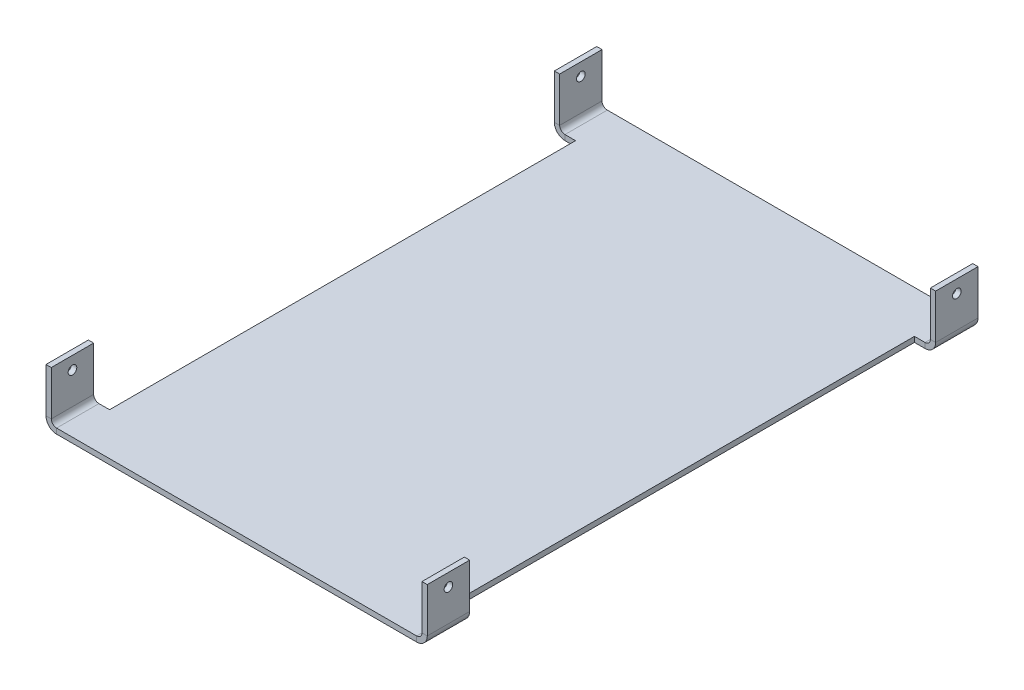
ISO-10303-21;
HEADER;
FILE_DESCRIPTION(('STEP AP214'),'2;1');
FILE_NAME('part.step','',(''),(''),'','','');
FILE_SCHEMA(('AUTOMOTIVE_DESIGN { 1 0 10303 214 1 1 1 1 }'));
ENDSEC;
DATA;
#1=APPLICATION_CONTEXT('core data for automotive mechanical design processes');
#2=APPLICATION_PROTOCOL_DEFINITION('international standard','automotive_design',2000,#1);
#3=PRODUCT_CONTEXT('',#1,'mechanical');
#4=PRODUCT('Part','Part','',(#3));
#5=PRODUCT_RELATED_PRODUCT_CATEGORY('part','',(#4));
#6=PRODUCT_DEFINITION_FORMATION('','',#4);
#7=PRODUCT_DEFINITION_CONTEXT('part definition',#1,'design');
#8=PRODUCT_DEFINITION('design','',#6,#7);
#9=PRODUCT_DEFINITION_SHAPE('','',#8);
#10=(LENGTH_UNIT() NAMED_UNIT(*) SI_UNIT(.MILLI.,.METRE.));
#11=(NAMED_UNIT(*) PLANE_ANGLE_UNIT() SI_UNIT($,.RADIAN.));
#12=(NAMED_UNIT(*) SI_UNIT($,.STERADIAN.) SOLID_ANGLE_UNIT());
#13=UNCERTAINTY_MEASURE_WITH_UNIT(LENGTH_MEASURE(1.E-05),#10,'distance_accuracy_value','');
#14=(GEOMETRIC_REPRESENTATION_CONTEXT(3) GLOBAL_UNCERTAINTY_ASSIGNED_CONTEXT((#13)) GLOBAL_UNIT_ASSIGNED_CONTEXT((#10,
#11,#12)) REPRESENTATION_CONTEXT('',''));
#15=CARTESIAN_POINT('',(0.,0.,0.));
#16=DIRECTION('',(0.,0.,1.));
#17=DIRECTION('',(1.,0.,0.));
#18=AXIS2_PLACEMENT_3D('',#15,#16,#17);
#19=CARTESIAN_POINT('',(-12.7,0.,304.8));
#20=DIRECTION('',(0.,0.,1.));
#21=DIRECTION('',(1.,0.,0.));
#22=AXIS2_PLACEMENT_3D('',#19,#20,#21);
#23=PLANE('',#22);
#24=DIRECTION('',(1.,0.,0.));
#25=VECTOR('',#24,1.);
#26=CARTESIAN_POINT('',(-228.6,3.175,304.8));
#27=LINE('',#26,#25);
#28=CARTESIAN_POINT('',(-12.7,3.175,304.8));
#29=VERTEX_POINT('',#28);
#30=CARTESIAN_POINT('',(-6.34999999999999,3.175,304.8));
#31=VERTEX_POINT('',#30);
#32=EDGE_CURVE('E258',#29,#31,#27,.T.);
#33=ORIENTED_EDGE('',*,*,#32,.T.);
#34=DIRECTION('',(0.,-1.,0.));
#35=VECTOR('',#34,1.);
#36=CARTESIAN_POINT('',(-6.34999999999999,3.175,304.8));
#37=LINE('',#36,#35);
#38=CARTESIAN_POINT('',(-6.35,0.,304.8));
#39=VERTEX_POINT('',#38);
#40=EDGE_CURVE('E11',#31,#39,#37,.T.);
#41=ORIENTED_EDGE('',*,*,#40,.T.);
#42=DIRECTION('',(1.,0.,0.));
#43=VECTOR('',#42,1.);
#44=CARTESIAN_POINT('',(-12.7,0.,304.8));
#45=LINE('',#44,#43);
#46=CARTESIAN_POINT('',(-12.7,0.,304.8));
#47=VERTEX_POINT('',#46);
#48=EDGE_CURVE('E239',#47,#39,#45,.T.);
#49=ORIENTED_EDGE('',*,*,#48,.F.);
#50=DIRECTION('',(0.,1.,0.));
#51=VECTOR('',#50,1.);
#52=CARTESIAN_POINT('',(-12.7,0.,304.8));
#53=LINE('',#52,#51);
#54=EDGE_CURVE('E223',#47,#29,#53,.T.);
#55=ORIENTED_EDGE('',*,*,#54,.T.);
#56=EDGE_LOOP('',(#33,#41,#49,#55));
#57=FACE_BOUND('',#56,.T.);
#58=ADVANCED_FACE('F38',(#57),#23,.F.);
#59=DIRECTION('',(0.,1.,0.));
#60=VECTOR('',#59,1.);
#61=CARTESIAN_POINT('',(0.,0.,304.8));
#62=LINE('',#61,#60);
#63=CARTESIAN_POINT('',(0.,6.35,304.8));
#64=VERTEX_POINT('',#63);
#65=CARTESIAN_POINT('',(0.,33.02,304.8));
#66=VERTEX_POINT('',#65);
#67=EDGE_CURVE('E254',#64,#66,#62,.T.);
#68=ORIENTED_EDGE('',*,*,#67,.F.);
#69=DIRECTION('',(-1.,0.,0.));
#70=VECTOR('',#69,1.);
#71=CARTESIAN_POINT('',(0.,6.35,304.8));
#72=LINE('',#71,#70);
#73=CARTESIAN_POINT('',(-3.175,6.35,304.8));
#74=VERTEX_POINT('',#73);
#75=EDGE_CURVE('E46',#64,#74,#72,.T.);
#76=ORIENTED_EDGE('',*,*,#75,.T.);
#77=DIRECTION('',(0.,1.,0.));
#78=VECTOR('',#77,1.);
#79=CARTESIAN_POINT('',(-3.175,0.,304.8));
#80=LINE('',#79,#78);
#81=CARTESIAN_POINT('',(-3.175,33.02,304.8));
#82=VERTEX_POINT('',#81);
#83=EDGE_CURVE('E262',#74,#82,#80,.T.);
#84=ORIENTED_EDGE('',*,*,#83,.T.);
#85=DIRECTION('',(1.,0.,0.));
#86=VECTOR('',#85,1.);
#87=CARTESIAN_POINT('',(-12.7,33.02,304.8));
#88=LINE('',#87,#86);
#89=EDGE_CURVE('E249',#82,#66,#88,.T.);
#90=ORIENTED_EDGE('',*,*,#89,.T.);
#91=EDGE_LOOP('',(#68,#76,#84,#90));
#92=FACE_BOUND('',#91,.T.);
#93=ADVANCED_FACE('F503',(#92),#23,.F.);
#94=CARTESIAN_POINT('',(-12.7,0.,25.4));
#95=DIRECTION('',(0.,0.,-1.));
#96=DIRECTION('',(-1.,0.,0.));
#97=AXIS2_PLACEMENT_3D('',#94,#95,#96);
#98=PLANE('',#97);
#99=DIRECTION('',(-1.,0.,0.));
#100=VECTOR('',#99,1.);
#101=CARTESIAN_POINT('',(-12.7,0.,25.4));
#102=LINE('',#101,#100);
#103=CARTESIAN_POINT('',(-6.35,0.,25.4));
#104=VERTEX_POINT('',#103);
#105=CARTESIAN_POINT('',(-12.7,0.,25.4));
#106=VERTEX_POINT('',#105);
#107=EDGE_CURVE('E236',#104,#106,#102,.T.);
#108=ORIENTED_EDGE('',*,*,#107,.F.);
#109=DIRECTION('',(0.,1.,0.));
#110=VECTOR('',#109,1.);
#111=CARTESIAN_POINT('',(-6.35,0.,25.4));
#112=LINE('',#111,#110);
#113=CARTESIAN_POINT('',(-6.34999999999999,3.175,25.4));
#114=VERTEX_POINT('',#113);
#115=EDGE_CURVE('E501',#104,#114,#112,.T.);
#116=ORIENTED_EDGE('',*,*,#115,.T.);
#117=DIRECTION('',(-1.,0.,0.));
#118=VECTOR('',#117,1.);
#119=CARTESIAN_POINT('',(-228.6,3.175,25.4000000000003));
#120=LINE('',#119,#118);
#121=CARTESIAN_POINT('',(-12.7,3.175,25.4));
#122=VERTEX_POINT('',#121);
#123=EDGE_CURVE('E267',#114,#122,#120,.T.);
#124=ORIENTED_EDGE('',*,*,#123,.T.);
#125=DIRECTION('',(0.,1.,0.));
#126=VECTOR('',#125,1.);
#127=CARTESIAN_POINT('',(-12.7,0.,25.4));
#128=LINE('',#127,#126);
#129=EDGE_CURVE('E235',#106,#122,#128,.T.);
#130=ORIENTED_EDGE('',*,*,#129,.F.);
#131=EDGE_LOOP('',(#108,#116,#124,#130));
#132=FACE_BOUND('',#131,.T.);
#133=ADVANCED_FACE('F587',(#132),#98,.F.);
#134=DIRECTION('',(0.,-1.,0.));
#135=VECTOR('',#134,1.);
#136=CARTESIAN_POINT('',(-3.175,0.,25.4));
#137=LINE('',#136,#135);
#138=CARTESIAN_POINT('',(-3.175,33.02,25.4));
#139=VERTEX_POINT('',#138);
#140=CARTESIAN_POINT('',(-3.175,6.35,25.4));
#141=VERTEX_POINT('',#140);
#142=EDGE_CURVE('E272',#139,#141,#137,.T.);
#143=ORIENTED_EDGE('',*,*,#142,.T.);
#144=DIRECTION('',(1.,0.,0.));
#145=VECTOR('',#144,1.);
#146=CARTESIAN_POINT('',(-3.175,6.35,25.4));
#147=LINE('',#146,#145);
#148=CARTESIAN_POINT('',(0.,6.35,25.4));
#149=VERTEX_POINT('',#148);
#150=EDGE_CURVE('E499',#141,#149,#147,.T.);
#151=ORIENTED_EDGE('',*,*,#150,.T.);
#152=DIRECTION('',(0.,-1.,0.));
#153=VECTOR('',#152,1.);
#154=CARTESIAN_POINT('',(0.,0.,25.4));
#155=LINE('',#154,#153);
#156=CARTESIAN_POINT('',(0.,33.02,25.4));
#157=VERTEX_POINT('',#156);
#158=EDGE_CURVE('E264',#157,#149,#155,.T.);
#159=ORIENTED_EDGE('',*,*,#158,.F.);
#160=DIRECTION('',(-1.,0.,0.));
#161=VECTOR('',#160,1.);
#162=CARTESIAN_POINT('',(-12.7,33.02,25.4));
#163=LINE('',#162,#161);
#164=EDGE_CURVE('E247',#157,#139,#163,.T.);
#165=ORIENTED_EDGE('',*,*,#164,.T.);
#166=EDGE_LOOP('',(#143,#151,#159,#165));
#167=FACE_BOUND('',#166,.T.);
#168=ADVANCED_FACE('F598',(#167),#98,.F.);
#169=CARTESIAN_POINT('',(-215.9,0.,25.4));
#170=DIRECTION('',(0.,0.,-1.));
#171=DIRECTION('',(-1.,0.,0.));
#172=AXIS2_PLACEMENT_3D('',#169,#170,#171);
#173=PLANE('',#172);
#174=DIRECTION('',(0.,1.,0.));
#175=VECTOR('',#174,1.);
#176=CARTESIAN_POINT('',(-228.6,33.02,25.4));
#177=LINE('',#176,#175);
#178=CARTESIAN_POINT('',(-228.6,6.35,25.4));
#179=VERTEX_POINT('',#178);
#180=CARTESIAN_POINT('',(-228.6,33.02,25.4));
#181=VERTEX_POINT('',#180);
#182=EDGE_CURVE('E295',#179,#181,#177,.T.);
#183=ORIENTED_EDGE('',*,*,#182,.F.);
#184=DIRECTION('',(1.,0.,0.));
#185=VECTOR('',#184,1.);
#186=CARTESIAN_POINT('',(-228.6,6.35,25.4));
#187=LINE('',#186,#185);
#188=CARTESIAN_POINT('',(-225.425,6.35,25.4));
#189=VERTEX_POINT('',#188);
#190=EDGE_CURVE('E497',#179,#189,#187,.T.);
#191=ORIENTED_EDGE('',*,*,#190,.T.);
#192=DIRECTION('',(0.,1.,0.));
#193=VECTOR('',#192,1.);
#194=CARTESIAN_POINT('',(-225.425,33.02,25.4));
#195=LINE('',#194,#193);
#196=CARTESIAN_POINT('',(-225.425,33.02,25.4));
#197=VERTEX_POINT('',#196);
#198=EDGE_CURVE('E298',#189,#197,#195,.T.);
#199=ORIENTED_EDGE('',*,*,#198,.T.);
#200=DIRECTION('',(-1.,0.,0.));
#201=VECTOR('',#200,1.);
#202=CARTESIAN_POINT('',(-215.9,33.02,25.4));
#203=LINE('',#202,#201);
#204=EDGE_CURVE('E276',#197,#181,#203,.T.);
#205=ORIENTED_EDGE('',*,*,#204,.T.);
#206=EDGE_LOOP('',(#183,#191,#199,#205));
#207=FACE_BOUND('',#206,.T.);
#208=ADVANCED_FACE('F608',(#207),#173,.F.);
#209=DIRECTION('',(-1.,0.,0.));
#210=VECTOR('',#209,1.);
#211=CARTESIAN_POINT('',(-228.6,3.175,25.4));
#212=LINE('',#211,#210);
#213=CARTESIAN_POINT('',(-215.9,3.175,25.4));
#214=VERTEX_POINT('',#213);
#215=CARTESIAN_POINT('',(-222.25,3.175,25.4));
#216=VERTEX_POINT('',#215);
#217=EDGE_CURVE('E303',#214,#216,#212,.T.);
#218=ORIENTED_EDGE('',*,*,#217,.T.);
#219=DIRECTION('',(0.,-1.,0.));
#220=VECTOR('',#219,1.);
#221=CARTESIAN_POINT('',(-222.25,3.175,25.4));
#222=LINE('',#221,#220);
#223=CARTESIAN_POINT('',(-222.25,0.,25.4));
#224=VERTEX_POINT('',#223);
#225=EDGE_CURVE('E60',#216,#224,#222,.T.);
#226=ORIENTED_EDGE('',*,*,#225,.T.);
#227=DIRECTION('',(-1.,0.,0.));
#228=VECTOR('',#227,1.);
#229=CARTESIAN_POINT('',(-215.9,0.,25.4));
#230=LINE('',#229,#228);
#231=CARTESIAN_POINT('',(-215.9,0.,25.4));
#232=VERTEX_POINT('',#231);
#233=EDGE_CURVE('E283',#232,#224,#230,.T.);
#234=ORIENTED_EDGE('',*,*,#233,.F.);
#235=DIRECTION('',(0.,1.,0.));
#236=VECTOR('',#235,1.);
#237=CARTESIAN_POINT('',(-215.9,0.,25.4));
#238=LINE('',#237,#236);
#239=EDGE_CURVE('E286',#232,#214,#238,.T.);
#240=ORIENTED_EDGE('',*,*,#239,.T.);
#241=EDGE_LOOP('',(#218,#226,#234,#240));
#242=FACE_BOUND('',#241,.T.);
#243=ADVANCED_FACE('F613',(#242),#173,.F.);
#244=CARTESIAN_POINT('',(-215.9,0.,304.8));
#245=DIRECTION('',(0.,0.,1.));
#246=DIRECTION('',(1.,0.,0.));
#247=AXIS2_PLACEMENT_3D('',#244,#245,#246);
#248=PLANE('',#247);
#249=DIRECTION('',(0.,-1.,0.));
#250=VECTOR('',#249,1.);
#251=CARTESIAN_POINT('',(-225.425,33.02,304.8));
#252=LINE('',#251,#250);
#253=CARTESIAN_POINT('',(-225.425,33.02,304.8));
#254=VERTEX_POINT('',#253);
#255=CARTESIAN_POINT('',(-225.425,6.35,304.8));
#256=VERTEX_POINT('',#255);
#257=EDGE_CURVE('E311',#254,#256,#252,.T.);
#258=ORIENTED_EDGE('',*,*,#257,.T.);
#259=DIRECTION('',(-1.,0.,0.));
#260=VECTOR('',#259,1.);
#261=CARTESIAN_POINT('',(-225.425,6.35,304.8));
#262=LINE('',#261,#260);
#263=CARTESIAN_POINT('',(-228.6,6.35,304.8));
#264=VERTEX_POINT('',#263);
#265=EDGE_CURVE('E494',#256,#264,#262,.T.);
#266=ORIENTED_EDGE('',*,*,#265,.T.);
#267=DIRECTION('',(0.,-1.,0.));
#268=VECTOR('',#267,1.);
#269=CARTESIAN_POINT('',(-228.6,33.02,304.8));
#270=LINE('',#269,#268);
#271=CARTESIAN_POINT('',(-228.6,33.02,304.8));
#272=VERTEX_POINT('',#271);
#273=EDGE_CURVE('E308',#272,#264,#270,.T.);
#274=ORIENTED_EDGE('',*,*,#273,.F.);
#275=DIRECTION('',(1.,0.,0.));
#276=VECTOR('',#275,1.);
#277=CARTESIAN_POINT('',(-215.9,33.02,304.8));
#278=LINE('',#277,#276);
#279=EDGE_CURVE('E278',#272,#254,#278,.T.);
#280=ORIENTED_EDGE('',*,*,#279,.T.);
#281=EDGE_LOOP('',(#258,#266,#274,#280));
#282=FACE_BOUND('',#281,.T.);
#283=ADVANCED_FACE('F682',(#282),#248,.F.);
#284=DIRECTION('',(1.,0.,0.));
#285=VECTOR('',#284,1.);
#286=CARTESIAN_POINT('',(-228.6,0.,304.8));
#287=LINE('',#286,#285);
#288=CARTESIAN_POINT('',(-222.25,0.,304.8));
#289=VERTEX_POINT('',#288);
#290=CARTESIAN_POINT('',(-215.9,0.,304.8));
#291=VERTEX_POINT('',#290);
#292=EDGE_CURVE('E483',#289,#291,#287,.T.);
#293=ORIENTED_EDGE('',*,*,#292,.F.);
#294=DIRECTION('',(0.,1.,0.));
#295=VECTOR('',#294,1.);
#296=CARTESIAN_POINT('',(-222.25,0.,304.8));
#297=LINE('',#296,#295);
#298=CARTESIAN_POINT('',(-222.25,3.175,304.8));
#299=VERTEX_POINT('',#298);
#300=EDGE_CURVE('E492',#289,#299,#297,.T.);
#301=ORIENTED_EDGE('',*,*,#300,.T.);
#302=DIRECTION('',(1.,0.,0.));
#303=VECTOR('',#302,1.);
#304=CARTESIAN_POINT('',(-228.6,3.175,304.8));
#305=LINE('',#304,#303);
#306=CARTESIAN_POINT('',(-215.9,3.175,304.8));
#307=VERTEX_POINT('',#306);
#308=EDGE_CURVE('E317',#299,#307,#305,.T.);
#309=ORIENTED_EDGE('',*,*,#308,.T.);
#310=DIRECTION('',(0.,1.,0.));
#311=VECTOR('',#310,1.);
#312=CARTESIAN_POINT('',(-215.9,0.,304.8));
#313=LINE('',#312,#311);
#314=EDGE_CURVE('E287',#291,#307,#313,.T.);
#315=ORIENTED_EDGE('',*,*,#314,.F.);
#316=EDGE_LOOP('',(#293,#301,#309,#315));
#317=FACE_BOUND('',#316,.T.);
#318=ADVANCED_FACE('F678',(#317),#248,.F.);
#319=CARTESIAN_POINT('',(0.,0.,330.2));
#320=DIRECTION('',(-1.,0.,0.));
#321=DIRECTION('',(0.,0.,1.));
#322=AXIS2_PLACEMENT_3D('',#319,#320,#321);
#323=PLANE('',#322);
#324=CARTESIAN_POINT('',(0.,25.4,12.7));
#325=DIRECTION('',(-1.,0.,0.));
#326=DIRECTION('',(0.,0.,1.));
#327=AXIS2_PLACEMENT_3D('',#324,#325,#326);
#328=CIRCLE('',#327,2.5796875);
#329=CARTESIAN_POINT('',(0.,25.4,15.2796875));
#330=VERTEX_POINT('',#329);
#331=EDGE_CURVE('E334',#330,#330,#328,.T.);
#332=ORIENTED_EDGE('',*,*,#331,.T.);
#333=EDGE_LOOP('',(#332));
#334=FACE_BOUND('',#333,.T.);
#335=DIRECTION('',(0.,0.,-1.));
#336=VECTOR('',#335,1.);
#337=CARTESIAN_POINT('',(0.,33.02,330.2));
#338=LINE('',#337,#336);
#339=CARTESIAN_POINT('',(0.,33.02,0.));
#340=VERTEX_POINT('',#339);
#341=EDGE_CURVE('E459',#157,#340,#338,.T.);
#342=ORIENTED_EDGE('',*,*,#341,.F.);
#343=ORIENTED_EDGE('',*,*,#158,.T.);
#344=DIRECTION('',(0.,0.,-1.));
#345=VECTOR('',#344,1.);
#346=CARTESIAN_POINT('',(0.,6.35,330.2));
#347=LINE('',#346,#345);
#348=CARTESIAN_POINT('',(0.,6.35,0.));
#349=VERTEX_POINT('',#348);
#350=EDGE_CURVE('E382',#149,#349,#347,.T.);
#351=ORIENTED_EDGE('',*,*,#350,.T.);
#352=DIRECTION('',(0.,1.,0.));
#353=VECTOR('',#352,1.);
#354=CARTESIAN_POINT('',(0.,0.,0.));
#355=LINE('',#354,#353);
#356=EDGE_CURVE('E345',#349,#340,#355,.T.);
#357=ORIENTED_EDGE('',*,*,#356,.T.);
#358=EDGE_LOOP('',(#342,#343,#351,#357));
#359=FACE_BOUND('',#358,.T.);
#360=ADVANCED_FACE('F579',(#334,#359),#323,.F.);
#361=CARTESIAN_POINT('',(-3.175,33.02,330.2));
#362=DIRECTION('',(0.,1.,0.));
#363=DIRECTION('',(0.,0.,1.));
#364=AXIS2_PLACEMENT_3D('',#361,#362,#363);
#365=PLANE('',#364);
#366=ORIENTED_EDGE('',*,*,#164,.F.);
#367=ORIENTED_EDGE('',*,*,#341,.T.);
#368=DIRECTION('',(1.,0.,0.));
#369=VECTOR('',#368,1.);
#370=CARTESIAN_POINT('',(-3.175,33.02,0.));
#371=LINE('',#370,#369);
#372=CARTESIAN_POINT('',(-3.175,33.02,0.));
#373=VERTEX_POINT('',#372);
#374=EDGE_CURVE('E385',#373,#340,#371,.T.);
#375=ORIENTED_EDGE('',*,*,#374,.F.);
#376=DIRECTION('',(0.,0.,-1.));
#377=VECTOR('',#376,1.);
#378=CARTESIAN_POINT('',(-3.175,33.02,330.2));
#379=LINE('',#378,#377);
#380=EDGE_CURVE('E455',#139,#373,#379,.T.);
#381=ORIENTED_EDGE('',*,*,#380,.F.);
#382=EDGE_LOOP('',(#366,#367,#375,#381));
#383=FACE_BOUND('',#382,.T.);
#384=ADVANCED_FACE('F569',(#383),#365,.T.);
#385=CARTESIAN_POINT('',(-3.175,0.,330.2));
#386=DIRECTION('',(-1.,0.,0.));
#387=DIRECTION('',(0.,0.,1.));
#388=AXIS2_PLACEMENT_3D('',#385,#386,#387);
#389=PLANE('',#388);
#390=ORIENTED_EDGE('',*,*,#142,.F.);
#391=ORIENTED_EDGE('',*,*,#380,.T.);
#392=DIRECTION('',(0.,1.,0.));
#393=VECTOR('',#392,1.);
#394=CARTESIAN_POINT('',(-3.175,0.,0.));
#395=LINE('',#394,#393);
#396=CARTESIAN_POINT('',(-3.175,6.35,0.));
#397=VERTEX_POINT('',#396);
#398=EDGE_CURVE('E388',#397,#373,#395,.T.);
#399=ORIENTED_EDGE('',*,*,#398,.F.);
#400=DIRECTION('',(0.,0.,-1.));
#401=VECTOR('',#400,1.);
#402=CARTESIAN_POINT('',(-3.175,6.35,330.2));
#403=LINE('',#402,#401);
#404=EDGE_CURVE('E451',#141,#397,#403,.T.);
#405=ORIENTED_EDGE('',*,*,#404,.F.);
#406=EDGE_LOOP('',(#390,#391,#399,#405));
#407=FACE_BOUND('',#406,.T.);
#408=CARTESIAN_POINT('',(-3.175,25.4,12.7));
#409=DIRECTION('',(-1.,0.,0.));
#410=DIRECTION('',(0.,0.,1.));
#411=AXIS2_PLACEMENT_3D('',#408,#409,#410);
#412=CIRCLE('',#411,2.5796875);
#413=CARTESIAN_POINT('',(-3.175,25.4,15.2796875));
#414=VERTEX_POINT('',#413);
#415=EDGE_CURVE('E342',#414,#414,#412,.T.);
#416=ORIENTED_EDGE('',*,*,#415,.F.);
#417=EDGE_LOOP('',(#416));
#418=FACE_BOUND('',#417,.T.);
#419=ADVANCED_FACE('F575',(#407,#418),#389,.T.);
#420=CARTESIAN_POINT('',(-6.35,6.35,330.2));
#421=DIRECTION('',(0.,0.,-1.));
#422=DIRECTION('',(-1.,0.,0.));
#423=AXIS2_PLACEMENT_3D('',#420,#421,#422);
#424=CYLINDRICAL_SURFACE('',#423,3.175);
#425=CARTESIAN_POINT('',(-6.35,6.35,25.4));
#426=DIRECTION('',(0.,0.,-1.));
#427=DIRECTION('',(-1.,0.,0.));
#428=AXIS2_PLACEMENT_3D('',#425,#426,#427);
#429=CIRCLE('',#428,3.175);
#430=EDGE_CURVE('E269',#141,#114,#429,.T.);
#431=ORIENTED_EDGE('',*,*,#430,.F.);
#432=ORIENTED_EDGE('',*,*,#404,.T.);
#433=CARTESIAN_POINT('',(-6.35,6.35,0.));
#434=DIRECTION('',(0.,0.,1.));
#435=DIRECTION('',(1.,0.,0.));
#436=AXIS2_PLACEMENT_3D('',#433,#434,#435);
#437=CIRCLE('',#436,3.175);
#438=CARTESIAN_POINT('',(-6.35,3.175,0.));
#439=VERTEX_POINT('',#438);
#440=EDGE_CURVE('E391',#439,#397,#437,.T.);
#441=ORIENTED_EDGE('',*,*,#440,.F.);
#442=DIRECTION('',(0.,0.,-1.));
#443=VECTOR('',#442,1.);
#444=CARTESIAN_POINT('',(-6.35,3.175,330.2));
#445=LINE('',#444,#443);
#446=EDGE_CURVE('E447',#114,#439,#445,.T.);
#447=ORIENTED_EDGE('',*,*,#446,.F.);
#448=EDGE_LOOP('',(#431,#432,#441,#447));
#449=FACE_BOUND('',#448,.T.);
#450=ADVANCED_FACE('F625',(#449),#424,.F.);
#451=CARTESIAN_POINT('',(-6.35,6.35,330.2));
#452=DIRECTION('',(0.,0.,-1.));
#453=DIRECTION('',(-1.,0.,0.));
#454=AXIS2_PLACEMENT_3D('',#451,#452,#453);
#455=CYLINDRICAL_SURFACE('',#454,6.35);
#456=ORIENTED_EDGE('',*,*,#350,.F.);
#457=CARTESIAN_POINT('',(-6.35,6.35,25.4));
#458=DIRECTION('',(0.,0.,-1.));
#459=DIRECTION('',(-1.,0.,0.));
#460=AXIS2_PLACEMENT_3D('',#457,#458,#459);
#461=CIRCLE('',#460,6.35);
#462=EDGE_CURVE('E489',#149,#104,#461,.T.);
#463=ORIENTED_EDGE('',*,*,#462,.T.);
#464=DIRECTION('',(0.,0.,-1.));
#465=VECTOR('',#464,1.);
#466=CARTESIAN_POINT('',(-6.34999999999999,0.,330.2));
#467=LINE('',#466,#465);
#468=CARTESIAN_POINT('',(-6.34999999999999,0.,0.));
#469=VERTEX_POINT('',#468);
#470=EDGE_CURVE('E420',#104,#469,#467,.T.);
#471=ORIENTED_EDGE('',*,*,#470,.T.);
#472=CARTESIAN_POINT('',(-6.35,6.35,0.));
#473=DIRECTION('',(0.,0.,-1.));
#474=DIRECTION('',(-1.,0.,0.));
#475=AXIS2_PLACEMENT_3D('',#472,#473,#474);
#476=CIRCLE('',#475,6.35);
#477=EDGE_CURVE('E349',#469,#349,#476,.F.);
#478=ORIENTED_EDGE('',*,*,#477,.T.);
#479=EDGE_LOOP('',(#456,#463,#471,#478));
#480=FACE_BOUND('',#479,.T.);
#481=ADVANCED_FACE('F715',(#480),#455,.T.);
#482=CARTESIAN_POINT('',(-222.25,6.35,330.2));
#483=DIRECTION('',(0.,0.,-1.));
#484=DIRECTION('',(-1.,0.,0.));
#485=AXIS2_PLACEMENT_3D('',#482,#483,#484);
#486=CYLINDRICAL_SURFACE('',#485,3.175);
#487=CARTESIAN_POINT('',(-222.25,6.35,304.8));
#488=DIRECTION('',(0.,0.,1.));
#489=DIRECTION('',(1.,0.,0.));
#490=AXIS2_PLACEMENT_3D('',#487,#488,#489);
#491=CIRCLE('',#490,3.175);
#492=EDGE_CURVE('E314',#256,#299,#491,.T.);
#493=ORIENTED_EDGE('',*,*,#492,.F.);
#494=DIRECTION('',(0.,0.,-1.));
#495=VECTOR('',#494,1.);
#496=CARTESIAN_POINT('',(-225.425,6.35,330.2));
#497=LINE('',#496,#495);
#498=CARTESIAN_POINT('',(-225.425,6.35,330.2));
#499=VERTEX_POINT('',#498);
#500=EDGE_CURVE('E440',#499,#256,#497,.T.);
#501=ORIENTED_EDGE('',*,*,#500,.F.);
#502=CARTESIAN_POINT('',(-222.25,6.35,330.2));
#503=DIRECTION('',(0.,0.,1.));
#504=DIRECTION('',(1.,0.,0.));
#505=AXIS2_PLACEMENT_3D('',#502,#503,#504);
#506=CIRCLE('',#505,3.175);
#507=CARTESIAN_POINT('',(-222.25,3.175,330.2));
#508=VERTEX_POINT('',#507);
#509=EDGE_CURVE('E361',#499,#508,#506,.T.);
#510=ORIENTED_EDGE('',*,*,#509,.T.);
#511=DIRECTION('',(0.,0.,-1.));
#512=VECTOR('',#511,1.);
#513=CARTESIAN_POINT('',(-222.25,3.175,330.2));
#514=LINE('',#513,#512);
#515=EDGE_CURVE('E444',#508,#299,#514,.T.);
#516=ORIENTED_EDGE('',*,*,#515,.T.);
#517=EDGE_LOOP('',(#493,#501,#510,#516));
#518=FACE_BOUND('',#517,.T.);
#519=ADVANCED_FACE('F531',(#518),#486,.F.);
#520=CARTESIAN_POINT('',(-225.425,33.02,330.2));
#521=DIRECTION('',(1.,0.,0.));
#522=DIRECTION('',(0.,0.,-1.));
#523=AXIS2_PLACEMENT_3D('',#520,#521,#522);
#524=PLANE('',#523);
#525=ORIENTED_EDGE('',*,*,#257,.F.);
#526=DIRECTION('',(0.,0.,-1.));
#527=VECTOR('',#526,1.);
#528=CARTESIAN_POINT('',(-225.425,33.02,330.2));
#529=LINE('',#528,#527);
#530=CARTESIAN_POINT('',(-225.425,33.02,330.2));
#531=VERTEX_POINT('',#530);
#532=EDGE_CURVE('E436',#531,#254,#529,.T.);
#533=ORIENTED_EDGE('',*,*,#532,.F.);
#534=DIRECTION('',(0.,1.,0.));
#535=VECTOR('',#534,1.);
#536=CARTESIAN_POINT('',(-225.425,33.02,330.2));
#537=LINE('',#536,#535);
#538=EDGE_CURVE('E364',#531,#499,#537,.F.);
#539=ORIENTED_EDGE('',*,*,#538,.T.);
#540=ORIENTED_EDGE('',*,*,#500,.T.);
#541=EDGE_LOOP('',(#525,#533,#539,#540));
#542=FACE_BOUND('',#541,.T.);
#543=CARTESIAN_POINT('',(-225.425,25.4,317.5));
#544=DIRECTION('',(1.,0.,0.));
#545=DIRECTION('',(0.,0.,-1.));
#546=AXIS2_PLACEMENT_3D('',#543,#544,#545);
#547=CIRCLE('',#546,2.57968750000001);
#548=CARTESIAN_POINT('',(-225.425,25.4,314.9203125));
#549=VERTEX_POINT('',#548);
#550=EDGE_CURVE('E325',#549,#549,#547,.T.);
#551=ORIENTED_EDGE('',*,*,#550,.F.);
#552=EDGE_LOOP('',(#551));
#553=FACE_BOUND('',#552,.T.);
#554=ADVANCED_FACE('F536',(#542,#553),#524,.T.);
#555=CARTESIAN_POINT('',(-228.6,33.02,330.2));
#556=DIRECTION('',(0.,1.,0.));
#557=DIRECTION('',(0.,0.,1.));
#558=AXIS2_PLACEMENT_3D('',#555,#556,#557);
#559=PLANE('',#558);
#560=ORIENTED_EDGE('',*,*,#279,.F.);
#561=DIRECTION('',(0.,0.,-1.));
#562=VECTOR('',#561,1.);
#563=CARTESIAN_POINT('',(-228.6,33.02,330.2));
#564=LINE('',#563,#562);
#565=CARTESIAN_POINT('',(-228.6,33.02,330.2));
#566=VERTEX_POINT('',#565);
#567=EDGE_CURVE('E432',#566,#272,#564,.T.);
#568=ORIENTED_EDGE('',*,*,#567,.F.);
#569=DIRECTION('',(1.,0.,0.));
#570=VECTOR('',#569,1.);
#571=CARTESIAN_POINT('',(-228.6,33.02,330.2));
#572=LINE('',#571,#570);
#573=EDGE_CURVE('E367',#566,#531,#572,.T.);
#574=ORIENTED_EDGE('',*,*,#573,.T.);
#575=ORIENTED_EDGE('',*,*,#532,.T.);
#576=EDGE_LOOP('',(#560,#568,#574,#575));
#577=FACE_BOUND('',#576,.T.);
#578=ADVANCED_FACE('F543',(#577),#559,.T.);
#579=CARTESIAN_POINT('',(-228.6,33.02,330.2));
#580=DIRECTION('',(1.,0.,0.));
#581=DIRECTION('',(0.,0.,-1.));
#582=AXIS2_PLACEMENT_3D('',#579,#580,#581);
#583=PLANE('',#582);
#584=CARTESIAN_POINT('',(-228.6,25.4,317.5));
#585=DIRECTION('',(-1.,0.,0.));
#586=DIRECTION('',(0.,0.,1.));
#587=AXIS2_PLACEMENT_3D('',#584,#585,#586);
#588=CIRCLE('',#587,2.57968750000001);
#589=CARTESIAN_POINT('',(-228.6,25.4,320.0796875));
#590=VERTEX_POINT('',#589);
#591=EDGE_CURVE('E321',#590,#590,#588,.T.);
#592=ORIENTED_EDGE('',*,*,#591,.F.);
#593=EDGE_LOOP('',(#592));
#594=FACE_BOUND('',#593,.T.);
#595=ORIENTED_EDGE('',*,*,#567,.T.);
#596=ORIENTED_EDGE('',*,*,#273,.T.);
#597=DIRECTION('',(0.,0.,-1.));
#598=VECTOR('',#597,1.);
#599=CARTESIAN_POINT('',(-228.6,6.35,330.2));
#600=LINE('',#599,#598);
#601=CARTESIAN_POINT('',(-228.6,6.35,330.2));
#602=VERTEX_POINT('',#601);
#603=EDGE_CURVE('E428',#602,#264,#600,.T.);
#604=ORIENTED_EDGE('',*,*,#603,.F.);
#605=DIRECTION('',(0.,-1.,0.));
#606=VECTOR('',#605,1.);
#607=CARTESIAN_POINT('',(-228.6,33.02,330.2));
#608=LINE('',#607,#606);
#609=EDGE_CURVE('E370',#566,#602,#608,.T.);
#610=ORIENTED_EDGE('',*,*,#609,.F.);
#611=EDGE_LOOP('',(#595,#596,#604,#610));
#612=FACE_BOUND('',#611,.T.);
#613=ADVANCED_FACE('F547',(#594,#612),#583,.F.);
#614=CARTESIAN_POINT('',(-222.25,6.35,330.2));
#615=DIRECTION('',(0.,0.,-1.));
#616=DIRECTION('',(-1.,0.,0.));
#617=AXIS2_PLACEMENT_3D('',#614,#615,#616);
#618=CYLINDRICAL_SURFACE('',#617,6.35);
#619=ORIENTED_EDGE('',*,*,#603,.T.);
#620=CARTESIAN_POINT('',(-222.25,6.35,304.8));
#621=DIRECTION('',(0.,0.,1.));
#622=DIRECTION('',(1.,0.,0.));
#623=AXIS2_PLACEMENT_3D('',#620,#621,#622);
#624=CIRCLE('',#623,6.35);
#625=EDGE_CURVE('E305',#264,#289,#624,.T.);
#626=ORIENTED_EDGE('',*,*,#625,.T.);
#627=DIRECTION('',(0.,0.,-1.));
#628=VECTOR('',#627,1.);
#629=CARTESIAN_POINT('',(-222.25,0.,330.2));
#630=LINE('',#629,#628);
#631=CARTESIAN_POINT('',(-222.25,0.,330.2));
#632=VERTEX_POINT('',#631);
#633=EDGE_CURVE('E424',#632,#289,#630,.T.);
#634=ORIENTED_EDGE('',*,*,#633,.F.);
#635=CARTESIAN_POINT('',(-222.25,6.35,330.2));
#636=DIRECTION('',(0.,0.,-1.));
#637=DIRECTION('',(-1.,0.,0.));
#638=AXIS2_PLACEMENT_3D('',#635,#636,#637);
#639=CIRCLE('',#638,6.35);
#640=EDGE_CURVE('E373',#602,#632,#639,.F.);
#641=ORIENTED_EDGE('',*,*,#640,.F.);
#642=EDGE_LOOP('',(#619,#626,#634,#641));
#643=FACE_BOUND('',#642,.T.);
#644=ADVANCED_FACE('F551',(#643),#618,.T.);
#645=CARTESIAN_POINT('',(-228.6,6.35,330.2));
#646=DIRECTION('',(0.,0.,1.));
#647=DIRECTION('',(1.,0.,0.));
#648=AXIS2_PLACEMENT_3D('',#645,#646,#647);
#649=PLANE('',#648);
#650=DIRECTION('',(1.,0.,0.));
#651=VECTOR('',#650,1.);
#652=CARTESIAN_POINT('',(-228.6,6.35,330.2));
#653=LINE('',#652,#651);
#654=EDGE_CURVE('E481',#602,#499,#653,.T.);
#655=ORIENTED_EDGE('',*,*,#654,.F.);
#656=ORIENTED_EDGE('',*,*,#640,.T.);
#657=DIRECTION('',(0.,-1.,0.));
#658=VECTOR('',#657,1.);
#659=CARTESIAN_POINT('',(-222.25,3.175,330.2));
#660=LINE('',#659,#658);
#661=EDGE_CURVE('E479',#508,#632,#660,.T.);
#662=ORIENTED_EDGE('',*,*,#661,.F.);
#663=ORIENTED_EDGE('',*,*,#509,.F.);
#664=EDGE_LOOP('',(#655,#656,#662,#663));
#665=FACE_BOUND('',#664,.T.);
#666=ADVANCED_FACE('F40',(#665),#649,.T.);
#667=CARTESIAN_POINT('',(-222.25,3.175,330.2));
#668=DIRECTION('',(0.,0.,1.));
#669=DIRECTION('',(1.,0.,0.));
#670=AXIS2_PLACEMENT_3D('',#667,#668,#669);
#671=PLANE('',#670);
#672=ORIENTED_EDGE('',*,*,#609,.T.);
#673=ORIENTED_EDGE('',*,*,#654,.T.);
#674=ORIENTED_EDGE('',*,*,#538,.F.);
#675=ORIENTED_EDGE('',*,*,#573,.F.);
#676=EDGE_LOOP('',(#672,#673,#674,#675));
#677=FACE_BOUND('',#676,.T.);
#678=ADVANCED_FACE('F540',(#677),#671,.T.);
#679=CARTESIAN_POINT('',(-222.25,0.,0.));
#680=DIRECTION('',(0.,0.,-1.));
#681=DIRECTION('',(-1.,0.,0.));
#682=AXIS2_PLACEMENT_3D('',#679,#680,#681);
#683=PLANE('',#682);
#684=DIRECTION('',(0.,1.,0.));
#685=VECTOR('',#684,1.);
#686=CARTESIAN_POINT('',(-222.25,0.,0.));
#687=LINE('',#686,#685);
#688=CARTESIAN_POINT('',(-222.25,0.,0.));
#689=VERTEX_POINT('',#688);
#690=CARTESIAN_POINT('',(-222.25,3.175,0.));
#691=VERTEX_POINT('',#690);
#692=EDGE_CURVE('E476',#689,#691,#687,.T.);
#693=ORIENTED_EDGE('',*,*,#692,.F.);
#694=CARTESIAN_POINT('',(-222.25,6.35,0.));
#695=DIRECTION('',(0.,0.,-1.));
#696=DIRECTION('',(-1.,0.,0.));
#697=AXIS2_PLACEMENT_3D('',#694,#695,#696);
#698=CIRCLE('',#697,6.35);
#699=CARTESIAN_POINT('',(-228.6,6.35,0.));
#700=VERTEX_POINT('',#699);
#701=EDGE_CURVE('E409',#700,#689,#698,.F.);
#702=ORIENTED_EDGE('',*,*,#701,.F.);
#703=DIRECTION('',(-1.,0.,0.));
#704=VECTOR('',#703,1.);
#705=CARTESIAN_POINT('',(-225.425,6.35,0.));
#706=LINE('',#705,#704);
#707=CARTESIAN_POINT('',(-225.425,6.35,0.));
#708=VERTEX_POINT('',#707);
#709=EDGE_CURVE('E473',#708,#700,#706,.T.);
#710=ORIENTED_EDGE('',*,*,#709,.F.);
#711=CARTESIAN_POINT('',(-222.25,6.35,0.));
#712=DIRECTION('',(0.,0.,1.));
#713=DIRECTION('',(1.,0.,0.));
#714=AXIS2_PLACEMENT_3D('',#711,#712,#713);
#715=CIRCLE('',#714,3.175);
#716=EDGE_CURVE('E397',#708,#691,#715,.T.);
#717=ORIENTED_EDGE('',*,*,#716,.T.);
#718=EDGE_LOOP('',(#693,#702,#710,#717));
#719=FACE_BOUND('',#718,.T.);
#720=ADVANCED_FACE('F646',(#719),#683,.T.);
#721=CARTESIAN_POINT('',(-225.425,6.35,0.));
#722=DIRECTION('',(0.,0.,-1.));
#723=DIRECTION('',(-1.,0.,0.));
#724=AXIS2_PLACEMENT_3D('',#721,#722,#723);
#725=PLANE('',#724);
#726=DIRECTION('',(1.,0.,0.));
#727=VECTOR('',#726,1.);
#728=CARTESIAN_POINT('',(-228.6,0.,0.));
#729=LINE('',#728,#727);
#730=EDGE_CURVE('E412',#689,#469,#729,.T.);
#731=ORIENTED_EDGE('',*,*,#730,.F.);
#732=ORIENTED_EDGE('',*,*,#692,.T.);
#733=DIRECTION('',(1.,0.,0.));
#734=VECTOR('',#733,1.);
#735=CARTESIAN_POINT('',(-228.6,3.175,0.));
#736=LINE('',#735,#734);
#737=EDGE_CURVE('E394',#691,#439,#736,.T.);
#738=ORIENTED_EDGE('',*,*,#737,.T.);
#739=DIRECTION('',(0.,-1.,0.));
#740=VECTOR('',#739,1.);
#741=CARTESIAN_POINT('',(-6.35,3.175,0.));
#742=LINE('',#741,#740);
#743=EDGE_CURVE('E463',#439,#469,#742,.T.);
#744=ORIENTED_EDGE('',*,*,#743,.T.);
#745=EDGE_LOOP('',(#731,#732,#738,#744));
#746=FACE_BOUND('',#745,.T.);
#747=ADVANCED_FACE('F639',(#746),#725,.T.);
#748=CARTESIAN_POINT('',(-6.34999999999999,0.,330.2));
#749=DIRECTION('',(0.,0.,1.));
#750=DIRECTION('',(1.,0.,0.));
#751=AXIS2_PLACEMENT_3D('',#748,#749,#750);
#752=PLANE('',#751);
#753=DIRECTION('',(0.,1.,0.));
#754=VECTOR('',#753,1.);
#755=CARTESIAN_POINT('',(-6.34999999999999,0.,330.2));
#756=LINE('',#755,#754);
#757=CARTESIAN_POINT('',(-6.34999999999999,0.,330.2));
#758=VERTEX_POINT('',#757);
#759=CARTESIAN_POINT('',(-6.35,3.175,330.2));
#760=VERTEX_POINT('',#759);
#761=EDGE_CURVE('E471',#758,#760,#756,.T.);
#762=ORIENTED_EDGE('',*,*,#761,.F.);
#763=CARTESIAN_POINT('',(-6.35,6.35,330.2));
#764=DIRECTION('',(0.,0.,-1.));
#765=DIRECTION('',(-1.,0.,0.));
#766=AXIS2_PLACEMENT_3D('',#763,#764,#765);
#767=CIRCLE('',#766,6.35);
#768=CARTESIAN_POINT('',(0.,6.35,330.2));
#769=VERTEX_POINT('',#768);
#770=EDGE_CURVE('E379',#758,#769,#767,.F.);
#771=ORIENTED_EDGE('',*,*,#770,.T.);
#772=DIRECTION('',(1.,0.,0.));
#773=VECTOR('',#772,1.);
#774=CARTESIAN_POINT('',(-3.175,6.35,330.2));
#775=LINE('',#774,#773);
#776=CARTESIAN_POINT('',(-3.175,6.35,330.2));
#777=VERTEX_POINT('',#776);
#778=EDGE_CURVE('E469',#777,#769,#775,.T.);
#779=ORIENTED_EDGE('',*,*,#778,.F.);
#780=CARTESIAN_POINT('',(-6.35,6.35,330.2));
#781=DIRECTION('',(0.,0.,1.));
#782=DIRECTION('',(1.,0.,0.));
#783=AXIS2_PLACEMENT_3D('',#780,#781,#782);
#784=CIRCLE('',#783,3.175);
#785=EDGE_CURVE('E355',#760,#777,#784,.T.);
#786=ORIENTED_EDGE('',*,*,#785,.F.);
#787=EDGE_LOOP('',(#762,#771,#779,#786));
#788=FACE_BOUND('',#787,.T.);
#789=ADVANCED_FACE('F518',(#788),#752,.T.);
#790=CARTESIAN_POINT('',(-3.175,6.35,330.2));
#791=DIRECTION('',(0.,0.,1.));
#792=DIRECTION('',(1.,0.,0.));
#793=AXIS2_PLACEMENT_3D('',#790,#791,#792);
#794=PLANE('',#793);
#795=DIRECTION('',(1.,0.,0.));
#796=VECTOR('',#795,1.);
#797=CARTESIAN_POINT('',(-228.6,0.,330.2));
#798=LINE('',#797,#796);
#799=EDGE_CURVE('E376',#632,#758,#798,.T.);
#800=ORIENTED_EDGE('',*,*,#799,.T.);
#801=ORIENTED_EDGE('',*,*,#761,.T.);
#802=DIRECTION('',(1.,0.,0.));
#803=VECTOR('',#802,1.);
#804=CARTESIAN_POINT('',(-228.6,3.175,330.2));
#805=LINE('',#804,#803);
#806=EDGE_CURVE('E358',#508,#760,#805,.T.);
#807=ORIENTED_EDGE('',*,*,#806,.F.);
#808=ORIENTED_EDGE('',*,*,#661,.T.);
#809=EDGE_LOOP('',(#800,#801,#807,#808));
#810=FACE_BOUND('',#809,.T.);
#811=ADVANCED_FACE('F526',(#810),#794,.T.);
#812=CARTESIAN_POINT('',(0.,6.35,0.));
#813=DIRECTION('',(0.,0.,-1.));
#814=DIRECTION('',(-1.,0.,0.));
#815=AXIS2_PLACEMENT_3D('',#812,#813,#814);
#816=PLANE('',#815);
#817=DIRECTION('',(-1.,0.,0.));
#818=VECTOR('',#817,1.);
#819=CARTESIAN_POINT('',(0.,6.35,0.));
#820=LINE('',#819,#818);
#821=EDGE_CURVE('E466',#349,#397,#820,.T.);
#822=ORIENTED_EDGE('',*,*,#821,.F.);
#823=ORIENTED_EDGE('',*,*,#477,.F.);
#824=ORIENTED_EDGE('',*,*,#743,.F.);
#825=ORIENTED_EDGE('',*,*,#440,.T.);
#826=EDGE_LOOP('',(#822,#823,#824,#825));
#827=FACE_BOUND('',#826,.T.);
#828=ADVANCED_FACE('F634',(#827),#816,.T.);
#829=CARTESIAN_POINT('',(-6.35,3.175,0.));
#830=DIRECTION('',(0.,0.,-1.));
#831=DIRECTION('',(-1.,0.,0.));
#832=AXIS2_PLACEMENT_3D('',#829,#830,#831);
#833=PLANE('',#832);
#834=ORIENTED_EDGE('',*,*,#356,.F.);
#835=ORIENTED_EDGE('',*,*,#821,.T.);
#836=ORIENTED_EDGE('',*,*,#398,.T.);
#837=ORIENTED_EDGE('',*,*,#374,.T.);
#838=EDGE_LOOP('',(#834,#835,#836,#837));
#839=FACE_BOUND('',#838,.T.);
#840=ADVANCED_FACE('F576',(#839),#833,.T.);
#841=CARTESIAN_POINT('',(0.,25.4,317.5));
#842=DIRECTION('',(-1.,0.,0.));
#843=DIRECTION('',(0.,0.,1.));
#844=AXIS2_PLACEMENT_3D('',#841,#842,#843);
#845=CIRCLE('',#844,2.57968750000001);
#846=CARTESIAN_POINT('',(0.,25.4,320.0796875));
#847=VERTEX_POINT('',#846);
#848=EDGE_CURVE('E322',#847,#847,#845,.T.);
#849=ORIENTED_EDGE('',*,*,#848,.T.);
#850=EDGE_LOOP('',(#849));
#851=FACE_BOUND('',#850,.T.);
#852=EDGE_CURVE('E417',#769,#64,#347,.T.);
#853=ORIENTED_EDGE('',*,*,#852,.T.);
#854=ORIENTED_EDGE('',*,*,#67,.T.);
#855=CARTESIAN_POINT('',(0.,33.02,330.2));
#856=VERTEX_POINT('',#855);
#857=EDGE_CURVE('E460',#856,#66,#338,.T.);
#858=ORIENTED_EDGE('',*,*,#857,.F.);
#859=DIRECTION('',(0.,1.,0.));
#860=VECTOR('',#859,1.);
#861=CARTESIAN_POINT('',(0.,0.,330.2));
#862=LINE('',#861,#860);
#863=EDGE_CURVE('E346',#769,#856,#862,.T.);
#864=ORIENTED_EDGE('',*,*,#863,.F.);
#865=EDGE_LOOP('',(#853,#854,#858,#864));
#866=FACE_BOUND('',#865,.T.);
#867=ADVANCED_FACE('F561',(#851,#866),#323,.F.);
#868=ORIENTED_EDGE('',*,*,#89,.F.);
#869=CARTESIAN_POINT('',(-3.175,33.02,330.2));
#870=VERTEX_POINT('',#869);
#871=EDGE_CURVE('E456',#870,#82,#379,.T.);
#872=ORIENTED_EDGE('',*,*,#871,.F.);
#873=DIRECTION('',(1.,0.,0.));
#874=VECTOR('',#873,1.);
#875=CARTESIAN_POINT('',(-3.175,33.02,330.2));
#876=LINE('',#875,#874);
#877=EDGE_CURVE('E348',#870,#856,#876,.T.);
#878=ORIENTED_EDGE('',*,*,#877,.T.);
#879=ORIENTED_EDGE('',*,*,#857,.T.);
#880=EDGE_LOOP('',(#868,#872,#878,#879));
#881=FACE_BOUND('',#880,.T.);
#882=ADVANCED_FACE('F566',(#881),#365,.T.);
#883=ORIENTED_EDGE('',*,*,#83,.F.);
#884=EDGE_CURVE('E452',#777,#74,#403,.T.);
#885=ORIENTED_EDGE('',*,*,#884,.F.);
#886=DIRECTION('',(0.,1.,0.));
#887=VECTOR('',#886,1.);
#888=CARTESIAN_POINT('',(-3.175,0.,330.2));
#889=LINE('',#888,#887);
#890=EDGE_CURVE('E352',#777,#870,#889,.T.);
#891=ORIENTED_EDGE('',*,*,#890,.T.);
#892=ORIENTED_EDGE('',*,*,#871,.T.);
#893=EDGE_LOOP('',(#883,#885,#891,#892));
#894=FACE_BOUND('',#893,.T.);
#895=CARTESIAN_POINT('',(-3.175,25.4,317.5));
#896=DIRECTION('',(-1.,0.,0.));
#897=DIRECTION('',(0.,0.,1.));
#898=AXIS2_PLACEMENT_3D('',#895,#896,#897);
#899=CIRCLE('',#898,2.57968750000001);
#900=CARTESIAN_POINT('',(-3.175,25.4,320.0796875));
#901=VERTEX_POINT('',#900);
#902=EDGE_CURVE('E330',#901,#901,#899,.T.);
#903=ORIENTED_EDGE('',*,*,#902,.F.);
#904=EDGE_LOOP('',(#903));
#905=FACE_BOUND('',#904,.T.);
#906=ADVANCED_FACE('F512',(#894,#905),#389,.T.);
#907=CARTESIAN_POINT('',(-6.35,6.35,304.8));
#908=DIRECTION('',(0.,0.,1.));
#909=DIRECTION('',(1.,0.,0.));
#910=AXIS2_PLACEMENT_3D('',#907,#908,#909);
#911=CIRCLE('',#910,3.175);
#912=EDGE_CURVE('E260',#31,#74,#911,.T.);
#913=ORIENTED_EDGE('',*,*,#912,.F.);
#914=EDGE_CURVE('E448',#760,#31,#445,.T.);
#915=ORIENTED_EDGE('',*,*,#914,.F.);
#916=ORIENTED_EDGE('',*,*,#785,.T.);
#917=ORIENTED_EDGE('',*,*,#884,.T.);
#918=EDGE_LOOP('',(#913,#915,#916,#917));
#919=FACE_BOUND('',#918,.T.);
#920=ADVANCED_FACE('F515',(#919),#424,.F.);
#921=CARTESIAN_POINT('',(-228.6,3.175,330.2));
#922=DIRECTION('',(0.,1.,0.));
#923=DIRECTION('',(0.,0.,1.));
#924=AXIS2_PLACEMENT_3D('',#921,#922,#923);
#925=PLANE('',#924);
#926=ORIENTED_EDGE('',*,*,#123,.F.);
#927=ORIENTED_EDGE('',*,*,#446,.T.);
#928=ORIENTED_EDGE('',*,*,#737,.F.);
#929=EDGE_CURVE('E443',#216,#691,#514,.T.);
#930=ORIENTED_EDGE('',*,*,#929,.F.);
#931=ORIENTED_EDGE('',*,*,#217,.F.);
#932=DIRECTION('',(0.,0.,-1.));
#933=VECTOR('',#932,1.);
#934=CARTESIAN_POINT('',(-215.9,3.175,330.2));
#935=LINE('',#934,#933);
#936=EDGE_CURVE('E319',#307,#214,#935,.T.);
#937=ORIENTED_EDGE('',*,*,#936,.F.);
#938=ORIENTED_EDGE('',*,*,#308,.F.);
#939=ORIENTED_EDGE('',*,*,#515,.F.);
#940=ORIENTED_EDGE('',*,*,#806,.T.);
#941=ORIENTED_EDGE('',*,*,#914,.T.);
#942=ORIENTED_EDGE('',*,*,#32,.F.);
#943=DIRECTION('',(0.,0.,1.));
#944=VECTOR('',#943,1.);
#945=CARTESIAN_POINT('',(-12.7,3.175,330.2));
#946=LINE('',#945,#944);
#947=EDGE_CURVE('E231',#122,#29,#946,.T.);
#948=ORIENTED_EDGE('',*,*,#947,.F.);
#949=EDGE_LOOP('',(#926,#927,#928,#930,#931,#937,#938,#939,#940,#941,#942,#948));
#950=FACE_BOUND('',#949,.T.);
#951=ADVANCED_FACE('F523',(#950),#925,.T.);
#952=CARTESIAN_POINT('',(-222.25,6.35,25.4));
#953=DIRECTION('',(0.,0.,-1.));
#954=DIRECTION('',(-1.,0.,0.));
#955=AXIS2_PLACEMENT_3D('',#952,#953,#954);
#956=CIRCLE('',#955,3.175);
#957=EDGE_CURVE('E300',#216,#189,#956,.T.);
#958=ORIENTED_EDGE('',*,*,#957,.F.);
#959=ORIENTED_EDGE('',*,*,#929,.T.);
#960=ORIENTED_EDGE('',*,*,#716,.F.);
#961=EDGE_CURVE('E439',#189,#708,#497,.T.);
#962=ORIENTED_EDGE('',*,*,#961,.F.);
#963=EDGE_LOOP('',(#958,#959,#960,#962));
#964=FACE_BOUND('',#963,.T.);
#965=ADVANCED_FACE('F651',(#964),#486,.F.);
#966=ORIENTED_EDGE('',*,*,#198,.F.);
#967=ORIENTED_EDGE('',*,*,#961,.T.);
#968=DIRECTION('',(0.,1.,0.));
#969=VECTOR('',#968,1.);
#970=CARTESIAN_POINT('',(-225.425,33.02,0.));
#971=LINE('',#970,#969);
#972=CARTESIAN_POINT('',(-225.425,33.02,0.));
#973=VERTEX_POINT('',#972);
#974=EDGE_CURVE('E400',#973,#708,#971,.F.);
#975=ORIENTED_EDGE('',*,*,#974,.F.);
#976=EDGE_CURVE('E435',#197,#973,#529,.T.);
#977=ORIENTED_EDGE('',*,*,#976,.F.);
#978=EDGE_LOOP('',(#966,#967,#975,#977));
#979=FACE_BOUND('',#978,.T.);
#980=CARTESIAN_POINT('',(-225.425,25.4,12.7));
#981=DIRECTION('',(1.,0.,0.));
#982=DIRECTION('',(0.,0.,-1.));
#983=AXIS2_PLACEMENT_3D('',#980,#981,#982);
#984=CIRCLE('',#983,2.5796875);
#985=CARTESIAN_POINT('',(-225.425,25.4,10.1203125));
#986=VERTEX_POINT('',#985);
#987=EDGE_CURVE('E337',#986,#986,#984,.T.);
#988=ORIENTED_EDGE('',*,*,#987,.F.);
#989=EDGE_LOOP('',(#988));
#990=FACE_BOUND('',#989,.T.);
#991=ADVANCED_FACE('F660',(#979,#990),#524,.T.);
#992=ORIENTED_EDGE('',*,*,#204,.F.);
#993=ORIENTED_EDGE('',*,*,#976,.T.);
#994=DIRECTION('',(1.,0.,0.));
#995=VECTOR('',#994,1.);
#996=CARTESIAN_POINT('',(-228.6,33.02,0.));
#997=LINE('',#996,#995);
#998=CARTESIAN_POINT('',(-228.6,33.02,0.));
#999=VERTEX_POINT('',#998);
#1000=EDGE_CURVE('E403',#999,#973,#997,.T.);
#1001=ORIENTED_EDGE('',*,*,#1000,.F.);
#1002=EDGE_CURVE('E431',#181,#999,#564,.T.);
#1003=ORIENTED_EDGE('',*,*,#1002,.F.);
#1004=EDGE_LOOP('',(#992,#993,#1001,#1003));
#1005=FACE_BOUND('',#1004,.T.);
#1006=ADVANCED_FACE('F666',(#1005),#559,.T.);
#1007=CARTESIAN_POINT('',(-228.6,25.4,12.7));
#1008=DIRECTION('',(-1.,0.,0.));
#1009=DIRECTION('',(0.,0.,1.));
#1010=AXIS2_PLACEMENT_3D('',#1007,#1008,#1009);
#1011=CIRCLE('',#1010,2.5796875);
#1012=CARTESIAN_POINT('',(-228.6,25.4,15.2796875));
#1013=VERTEX_POINT('',#1012);
#1014=EDGE_CURVE('E333',#1013,#1013,#1011,.T.);
#1015=ORIENTED_EDGE('',*,*,#1014,.F.);
#1016=EDGE_LOOP('',(#1015));
#1017=FACE_BOUND('',#1016,.T.);
#1018=EDGE_CURVE('E427',#179,#700,#600,.T.);
#1019=ORIENTED_EDGE('',*,*,#1018,.F.);
#1020=ORIENTED_EDGE('',*,*,#182,.T.);
#1021=ORIENTED_EDGE('',*,*,#1002,.T.);
#1022=DIRECTION('',(0.,-1.,0.));
#1023=VECTOR('',#1022,1.);
#1024=CARTESIAN_POINT('',(-228.6,33.02,0.));
#1025=LINE('',#1024,#1023);
#1026=EDGE_CURVE('E406',#999,#700,#1025,.T.);
#1027=ORIENTED_EDGE('',*,*,#1026,.T.);
#1028=EDGE_LOOP('',(#1019,#1020,#1021,#1027));
#1029=FACE_BOUND('',#1028,.T.);
#1030=ADVANCED_FACE('F669',(#1017,#1029),#583,.F.);
#1031=EDGE_CURVE('E423',#224,#689,#630,.T.);
#1032=ORIENTED_EDGE('',*,*,#1031,.F.);
#1033=CARTESIAN_POINT('',(-222.25,6.35,25.4));
#1034=DIRECTION('',(0.,0.,-1.));
#1035=DIRECTION('',(-1.,0.,0.));
#1036=AXIS2_PLACEMENT_3D('',#1033,#1034,#1035);
#1037=CIRCLE('',#1036,6.35);
#1038=EDGE_CURVE('E290',#224,#179,#1037,.T.);
#1039=ORIENTED_EDGE('',*,*,#1038,.T.);
#1040=ORIENTED_EDGE('',*,*,#1018,.T.);
#1041=ORIENTED_EDGE('',*,*,#701,.T.);
#1042=EDGE_LOOP('',(#1032,#1039,#1040,#1041));
#1043=FACE_BOUND('',#1042,.T.);
#1044=ADVANCED_FACE('F672',(#1043),#618,.T.);
#1045=CARTESIAN_POINT('',(-228.6,0.,330.2));
#1046=DIRECTION('',(0.,1.,0.));
#1047=DIRECTION('',(0.,0.,1.));
#1048=AXIS2_PLACEMENT_3D('',#1045,#1046,#1047);
#1049=PLANE('',#1048);
#1050=ORIENTED_EDGE('',*,*,#470,.F.);
#1051=ORIENTED_EDGE('',*,*,#107,.T.);
#1052=DIRECTION('',(0.,0.,1.));
#1053=VECTOR('',#1052,1.);
#1054=CARTESIAN_POINT('',(-12.7,0.,304.8));
#1055=LINE('',#1054,#1053);
#1056=EDGE_CURVE('E228',#106,#47,#1055,.T.);
#1057=ORIENTED_EDGE('',*,*,#1056,.T.);
#1058=ORIENTED_EDGE('',*,*,#48,.T.);
#1059=EDGE_CURVE('E421',#758,#39,#467,.T.);
#1060=ORIENTED_EDGE('',*,*,#1059,.F.);
#1061=ORIENTED_EDGE('',*,*,#799,.F.);
#1062=ORIENTED_EDGE('',*,*,#633,.T.);
#1063=ORIENTED_EDGE('',*,*,#292,.T.);
#1064=DIRECTION('',(0.,0.,-1.));
#1065=VECTOR('',#1064,1.);
#1066=CARTESIAN_POINT('',(-215.9,0.,304.8));
#1067=LINE('',#1066,#1065);
#1068=EDGE_CURVE('E280',#291,#232,#1067,.T.);
#1069=ORIENTED_EDGE('',*,*,#1068,.T.);
#1070=ORIENTED_EDGE('',*,*,#233,.T.);
#1071=ORIENTED_EDGE('',*,*,#1031,.T.);
#1072=ORIENTED_EDGE('',*,*,#730,.T.);
#1073=EDGE_LOOP('',(#1050,#1051,#1057,#1058,#1060,#1061,#1062,#1063,#1069,#1070,#1071,#1072));
#1074=FACE_BOUND('',#1073,.T.);
#1075=ADVANCED_FACE('F245',(#1074),#1049,.F.);
#1076=ORIENTED_EDGE('',*,*,#1059,.T.);
#1077=CARTESIAN_POINT('',(-6.35,6.35,304.8));
#1078=DIRECTION('',(0.,0.,1.));
#1079=DIRECTION('',(1.,0.,0.));
#1080=AXIS2_PLACEMENT_3D('',#1077,#1078,#1079);
#1081=CIRCLE('',#1080,6.35);
#1082=EDGE_CURVE('E486',#39,#64,#1081,.T.);
#1083=ORIENTED_EDGE('',*,*,#1082,.T.);
#1084=ORIENTED_EDGE('',*,*,#852,.F.);
#1085=ORIENTED_EDGE('',*,*,#770,.F.);
#1086=EDGE_LOOP('',(#1076,#1083,#1084,#1085));
#1087=FACE_BOUND('',#1086,.T.);
#1088=ADVANCED_FACE('F557',(#1087),#455,.T.);
#1089=CARTESIAN_POINT('',(-6.35,6.35,330.2));
#1090=DIRECTION('',(0.,0.,1.));
#1091=DIRECTION('',(1.,0.,0.));
#1092=AXIS2_PLACEMENT_3D('',#1089,#1090,#1091);
#1093=PLANE('',#1092);
#1094=ORIENTED_EDGE('',*,*,#863,.T.);
#1095=ORIENTED_EDGE('',*,*,#877,.F.);
#1096=ORIENTED_EDGE('',*,*,#890,.F.);
#1097=ORIENTED_EDGE('',*,*,#778,.T.);
#1098=EDGE_LOOP('',(#1094,#1095,#1096,#1097));
#1099=FACE_BOUND('',#1098,.T.);
#1100=ADVANCED_FACE('F564',(#1099),#1093,.T.);
#1101=CARTESIAN_POINT('',(-6.35,6.35,0.));
#1102=DIRECTION('',(0.,0.,1.));
#1103=DIRECTION('',(1.,0.,0.));
#1104=AXIS2_PLACEMENT_3D('',#1101,#1102,#1103);
#1105=PLANE('',#1104);
#1106=ORIENTED_EDGE('',*,*,#974,.T.);
#1107=ORIENTED_EDGE('',*,*,#709,.T.);
#1108=ORIENTED_EDGE('',*,*,#1026,.F.);
#1109=ORIENTED_EDGE('',*,*,#1000,.T.);
#1110=EDGE_LOOP('',(#1106,#1107,#1108,#1109));
#1111=FACE_BOUND('',#1110,.T.);
#1112=ADVANCED_FACE('F654',(#1111),#1105,.F.);
#1113=CARTESIAN_POINT('',(0.,25.4,12.7));
#1114=DIRECTION('',(-1.,0.,0.));
#1115=DIRECTION('',(0.,0.,1.));
#1116=AXIS2_PLACEMENT_3D('',#1113,#1114,#1115);
#1117=CYLINDRICAL_SURFACE('',#1116,2.5796875);
#1118=ORIENTED_EDGE('',*,*,#987,.T.);
#1119=EDGE_LOOP('',(#1118));
#1120=FACE_BOUND('',#1119,.T.);
#1121=ORIENTED_EDGE('',*,*,#1014,.T.);
#1122=EDGE_LOOP('',(#1121));
#1123=FACE_BOUND('',#1122,.T.);
#1124=ADVANCED_FACE('F705',(#1120,#1123),#1117,.F.);
#1125=ORIENTED_EDGE('',*,*,#415,.T.);
#1126=EDGE_LOOP('',(#1125));
#1127=FACE_BOUND('',#1126,.T.);
#1128=ORIENTED_EDGE('',*,*,#331,.F.);
#1129=EDGE_LOOP('',(#1128));
#1130=FACE_BOUND('',#1129,.T.);
#1131=ADVANCED_FACE('F701',(#1127,#1130),#1117,.F.);
#1132=CARTESIAN_POINT('',(0.,25.4,317.5));
#1133=DIRECTION('',(-1.,0.,0.));
#1134=DIRECTION('',(0.,0.,1.));
#1135=AXIS2_PLACEMENT_3D('',#1132,#1133,#1134);
#1136=CYLINDRICAL_SURFACE('',#1135,2.57968750000001);
#1137=ORIENTED_EDGE('',*,*,#550,.T.);
#1138=EDGE_LOOP('',(#1137));
#1139=FACE_BOUND('',#1138,.T.);
#1140=ORIENTED_EDGE('',*,*,#591,.T.);
#1141=EDGE_LOOP('',(#1140));
#1142=FACE_BOUND('',#1141,.T.);
#1143=ADVANCED_FACE('F695',(#1139,#1142),#1136,.F.);
#1144=ORIENTED_EDGE('',*,*,#902,.T.);
#1145=EDGE_LOOP('',(#1144));
#1146=FACE_BOUND('',#1145,.T.);
#1147=ORIENTED_EDGE('',*,*,#848,.F.);
#1148=EDGE_LOOP('',(#1147));
#1149=FACE_BOUND('',#1148,.T.);
#1150=ADVANCED_FACE('F690',(#1146,#1149),#1136,.F.);
#1151=ORIENTED_EDGE('',*,*,#265,.F.);
#1152=ORIENTED_EDGE('',*,*,#492,.T.);
#1153=ORIENTED_EDGE('',*,*,#300,.F.);
#1154=ORIENTED_EDGE('',*,*,#625,.F.);
#1155=EDGE_LOOP('',(#1151,#1152,#1153,#1154));
#1156=FACE_BOUND('',#1155,.T.);
#1157=ADVANCED_FACE('F680',(#1156),#248,.F.);
#1158=ORIENTED_EDGE('',*,*,#190,.F.);
#1159=ORIENTED_EDGE('',*,*,#1038,.F.);
#1160=ORIENTED_EDGE('',*,*,#225,.F.);
#1161=ORIENTED_EDGE('',*,*,#957,.T.);
#1162=EDGE_LOOP('',(#1158,#1159,#1160,#1161));
#1163=FACE_BOUND('',#1162,.T.);
#1164=ADVANCED_FACE('F602',(#1163),#173,.F.);
#1165=CARTESIAN_POINT('',(-215.9,0.,304.8));
#1166=DIRECTION('',(1.,0.,0.));
#1167=DIRECTION('',(0.,0.,-1.));
#1168=AXIS2_PLACEMENT_3D('',#1165,#1166,#1167);
#1169=PLANE('',#1168);
#1170=ORIENTED_EDGE('',*,*,#936,.T.);
#1171=ORIENTED_EDGE('',*,*,#239,.F.);
#1172=ORIENTED_EDGE('',*,*,#1068,.F.);
#1173=ORIENTED_EDGE('',*,*,#314,.T.);
#1174=EDGE_LOOP('',(#1170,#1171,#1172,#1173));
#1175=FACE_BOUND('',#1174,.T.);
#1176=ADVANCED_FACE('F596',(#1175),#1169,.F.);
#1177=ORIENTED_EDGE('',*,*,#115,.F.);
#1178=ORIENTED_EDGE('',*,*,#462,.F.);
#1179=ORIENTED_EDGE('',*,*,#150,.F.);
#1180=ORIENTED_EDGE('',*,*,#430,.T.);
#1181=EDGE_LOOP('',(#1177,#1178,#1179,#1180));
#1182=FACE_BOUND('',#1181,.T.);
#1183=ADVANCED_FACE('F591',(#1182),#98,.F.);
#1184=ORIENTED_EDGE('',*,*,#40,.F.);
#1185=ORIENTED_EDGE('',*,*,#912,.T.);
#1186=ORIENTED_EDGE('',*,*,#75,.F.);
#1187=ORIENTED_EDGE('',*,*,#1082,.F.);
#1188=EDGE_LOOP('',(#1184,#1185,#1186,#1187));
#1189=FACE_BOUND('',#1188,.T.);
#1190=ADVANCED_FACE('F507',(#1189),#23,.F.);
#1191=CARTESIAN_POINT('',(-12.7,0.,304.8));
#1192=DIRECTION('',(-1.,0.,0.));
#1193=DIRECTION('',(0.,0.,1.));
#1194=AXIS2_PLACEMENT_3D('',#1191,#1192,#1193);
#1195=PLANE('',#1194);
#1196=ORIENTED_EDGE('',*,*,#947,.T.);
#1197=ORIENTED_EDGE('',*,*,#54,.F.);
#1198=ORIENTED_EDGE('',*,*,#1056,.F.);
#1199=ORIENTED_EDGE('',*,*,#129,.T.);
#1200=EDGE_LOOP('',(#1196,#1197,#1198,#1199));
#1201=FACE_BOUND('',#1200,.T.);
#1202=ADVANCED_FACE('F225',(#1201),#1195,.F.);
#1203=CLOSED_SHELL('',(#58,#93,#133,#168,#208,#243,#283,#318,#360,#384,#419,#450,#481,#519,#554,
#578,#613,#644,#666,#678,#720,#747,#789,#811,#828,#840,#867,#882,#906,#920,#951,#965,#991,#1006,
#1030,#1044,#1075,#1088,#1100,#1112,#1124,#1131,#1143,#1150,#1157,#1164,#1176,#1183,#1190,#1202));
#1204=MANIFOLD_SOLID_BREP('B2',#1203);
#1205=ADVANCED_BREP_SHAPE_REPRESENTATION('',(#18,#1204),#14);
#1206=SHAPE_DEFINITION_REPRESENTATION(#9,#1205);
ENDSEC;
END-ISO-10303-21;
